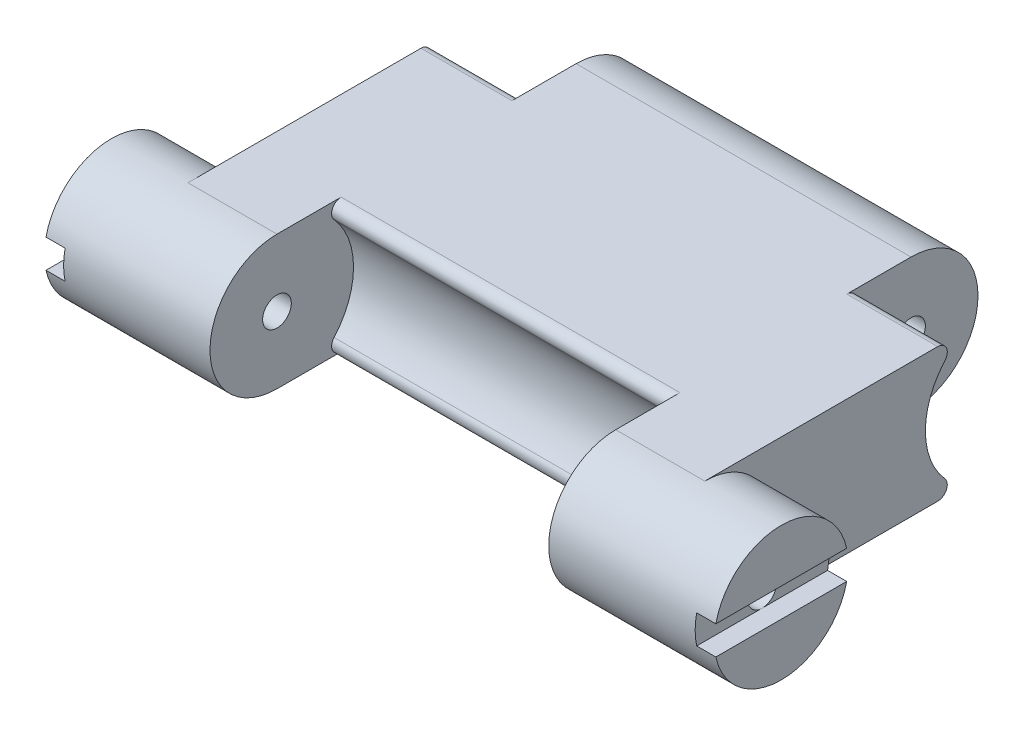
ISO-10303-21;
HEADER;
FILE_DESCRIPTION(('STEP AP214'),'2;1');
FILE_NAME('part.step','',(''),(''),'','','');
FILE_SCHEMA(('AUTOMOTIVE_DESIGN { 1 0 10303 214 1 1 1 1 }'));
ENDSEC;
DATA;
#1=APPLICATION_CONTEXT('core data for automotive mechanical design processes');
#2=APPLICATION_PROTOCOL_DEFINITION('international standard','automotive_design',2000,#1);
#3=PRODUCT_CONTEXT('',#1,'mechanical');
#4=PRODUCT('Part','Part','',(#3));
#5=PRODUCT_RELATED_PRODUCT_CATEGORY('part','',(#4));
#6=PRODUCT_DEFINITION_FORMATION('','',#4);
#7=PRODUCT_DEFINITION_CONTEXT('part definition',#1,'design');
#8=PRODUCT_DEFINITION('design','',#6,#7);
#9=PRODUCT_DEFINITION_SHAPE('','',#8);
#10=(LENGTH_UNIT() NAMED_UNIT(*) SI_UNIT(.MILLI.,.METRE.));
#11=(NAMED_UNIT(*) PLANE_ANGLE_UNIT() SI_UNIT($,.RADIAN.));
#12=(NAMED_UNIT(*) SI_UNIT($,.STERADIAN.) SOLID_ANGLE_UNIT());
#13=UNCERTAINTY_MEASURE_WITH_UNIT(LENGTH_MEASURE(1.E-05),#10,'distance_accuracy_value','');
#14=(GEOMETRIC_REPRESENTATION_CONTEXT(3) GLOBAL_UNCERTAINTY_ASSIGNED_CONTEXT((#13)) GLOBAL_UNIT_ASSIGNED_CONTEXT((#10,
#11,#12)) REPRESENTATION_CONTEXT('',''));
#15=CARTESIAN_POINT('',(0.,0.,0.));
#16=DIRECTION('',(0.,0.,1.));
#17=DIRECTION('',(1.,0.,0.));
#18=AXIS2_PLACEMENT_3D('',#15,#16,#17);
#19=CARTESIAN_POINT('',(16.5,0.,0.));
#20=DIRECTION('',(-1.,0.,0.));
#21=DIRECTION('',(0.,0.,1.));
#22=AXIS2_PLACEMENT_3D('',#19,#20,#21);
#23=PLANE('',#22);
#24=DIRECTION('',(0.,0.,1.));
#25=VECTOR('',#24,1.);
#26=CARTESIAN_POINT('',(16.5,4.25,11.365));
#27=LINE('',#26,#25);
#28=CARTESIAN_POINT('',(16.5,4.25,4.34630141720567));
#29=VERTEX_POINT('',#28);
#30=CARTESIAN_POINT('',(16.5,4.25,7.765));
#31=VERTEX_POINT('',#30);
#32=EDGE_CURVE('E299',#29,#31,#27,.T.);
#33=ORIENTED_EDGE('',*,*,#32,.T.);
#34=CARTESIAN_POINT('',(16.5,3.5,7.765));
#35=DIRECTION('',(-1.,0.,0.));
#36=DIRECTION('',(0.,0.,1.));
#37=AXIS2_PLACEMENT_3D('',#34,#35,#36);
#38=CIRCLE('',#37,0.749999999999999);
#39=CARTESIAN_POINT('',(16.5,2.75,7.765));
#40=VERTEX_POINT('',#39);
#41=EDGE_CURVE('E63',#31,#40,#38,.T.);
#42=ORIENTED_EDGE('',*,*,#41,.T.);
#43=DIRECTION('',(0.,0.,-1.));
#44=VECTOR('',#43,1.);
#45=CARTESIAN_POINT('',(16.5,2.75,11.365));
#46=LINE('',#45,#44);
#47=CARTESIAN_POINT('',(16.5,2.75,4.34630141720567));
#48=VERTEX_POINT('',#47);
#49=EDGE_CURVE('E298',#40,#48,#46,.T.);
#50=ORIENTED_EDGE('',*,*,#49,.T.);
#51=CARTESIAN_POINT('',(16.5,3.5,7.765));
#52=DIRECTION('',(-1.,0.,0.));
#53=DIRECTION('',(0.,0.,1.));
#54=AXIS2_PLACEMENT_3D('',#51,#52,#53);
#55=CIRCLE('',#54,3.5);
#56=EDGE_CURVE('E408',#29,#48,#55,.T.);
#57=ORIENTED_EDGE('',*,*,#56,.F.);
#58=EDGE_LOOP('',(#33,#42,#50,#57));
#59=FACE_BOUND('',#58,.T.);
#60=ADVANCED_FACE('F47',(#59),#23,.F.);
#61=CARTESIAN_POINT('',(-16.5,0.,0.));
#62=DIRECTION('',(1.,0.,0.));
#63=DIRECTION('',(0.,0.,1.));
#64=AXIS2_PLACEMENT_3D('',#61,#62,#63);
#65=PLANE('',#64);
#66=DIRECTION('',(0.,0.,1.));
#67=VECTOR('',#66,1.);
#68=CARTESIAN_POINT('',(-16.5,4.25,11.365));
#69=LINE('',#68,#67);
#70=CARTESIAN_POINT('',(-16.5,4.25,7.765));
#71=VERTEX_POINT('',#70);
#72=CARTESIAN_POINT('',(-16.5,4.25,11.1836985827943));
#73=VERTEX_POINT('',#72);
#74=EDGE_CURVE('E246',#71,#73,#69,.T.);
#75=ORIENTED_EDGE('',*,*,#74,.F.);
#76=CARTESIAN_POINT('',(-16.5,3.5,7.765));
#77=DIRECTION('',(1.,0.,0.));
#78=DIRECTION('',(0.,0.,-1.));
#79=AXIS2_PLACEMENT_3D('',#76,#77,#78);
#80=CIRCLE('',#79,0.749999999999999);
#81=CARTESIAN_POINT('',(-16.5,2.75,7.765));
#82=VERTEX_POINT('',#81);
#83=EDGE_CURVE('E70',#71,#82,#80,.T.);
#84=ORIENTED_EDGE('',*,*,#83,.T.);
#85=DIRECTION('',(0.,0.,-1.));
#86=VECTOR('',#85,1.);
#87=CARTESIAN_POINT('',(-16.5,2.75,11.365));
#88=LINE('',#87,#86);
#89=CARTESIAN_POINT('',(-16.5,2.75,11.1836985827943));
#90=VERTEX_POINT('',#89);
#91=EDGE_CURVE('E244',#90,#82,#88,.T.);
#92=ORIENTED_EDGE('',*,*,#91,.F.);
#93=CARTESIAN_POINT('',(-16.5,3.5,7.765));
#94=DIRECTION('',(1.,0.,0.));
#95=DIRECTION('',(0.,0.,-1.));
#96=AXIS2_PLACEMENT_3D('',#93,#94,#95);
#97=CIRCLE('',#96,3.5);
#98=EDGE_CURVE('E435',#73,#90,#97,.T.);
#99=ORIENTED_EDGE('',*,*,#98,.F.);
#100=EDGE_LOOP('',(#75,#84,#92,#99));
#101=FACE_BOUND('',#100,.T.);
#102=ADVANCED_FACE('F241',(#101),#65,.F.);
#103=CARTESIAN_POINT('',(17.5,3.5,7.765));
#104=DIRECTION('',(-1.,0.,0.));
#105=DIRECTION('',(0.,0.,1.));
#106=AXIS2_PLACEMENT_3D('',#103,#104,#105);
#107=CYLINDRICAL_SURFACE('',#106,3.5);
#108=CARTESIAN_POINT('',(-8.85,3.5,7.765));
#109=DIRECTION('',(1.,0.,0.));
#110=DIRECTION('',(0.,0.,-1.));
#111=AXIS2_PLACEMENT_3D('',#108,#109,#110);
#112=CIRCLE('',#111,3.5);
#113=CARTESIAN_POINT('',(-8.85,7.,7.765));
#114=VERTEX_POINT('',#113);
#115=CARTESIAN_POINT('',(-8.85,0.,7.765));
#116=VERTEX_POINT('',#115);
#117=EDGE_CURVE('E397',#114,#116,#112,.T.);
#118=ORIENTED_EDGE('',*,*,#117,.F.);
#119=DIRECTION('',(-1.,0.,0.));
#120=VECTOR('',#119,1.);
#121=CARTESIAN_POINT('',(17.5,7.,7.765));
#122=LINE('',#121,#120);
#123=CARTESIAN_POINT('',(-13.5,7.,7.765));
#124=VERTEX_POINT('',#123);
#125=EDGE_CURVE('E367',#114,#124,#122,.T.);
#126=ORIENTED_EDGE('',*,*,#125,.T.);
#127=CARTESIAN_POINT('',(-13.5,3.5,7.765));
#128=DIRECTION('',(1.,0.,0.));
#129=DIRECTION('',(0.,0.,-1.));
#130=AXIS2_PLACEMENT_3D('',#127,#128,#129);
#131=CIRCLE('',#130,3.5);
#132=CARTESIAN_POINT('',(-13.5,0.,7.765));
#133=VERTEX_POINT('',#132);
#134=EDGE_CURVE('E343',#133,#124,#131,.T.);
#135=ORIENTED_EDGE('',*,*,#134,.F.);
#136=DIRECTION('',(-1.,0.,0.));
#137=VECTOR('',#136,1.);
#138=CARTESIAN_POINT('',(17.5,0.,7.765));
#139=LINE('',#138,#137);
#140=EDGE_CURVE('E385',#116,#133,#139,.T.);
#141=ORIENTED_EDGE('',*,*,#140,.F.);
#142=EDGE_LOOP('',(#118,#126,#135,#141));
#143=FACE_BOUND('',#142,.T.);
#144=DIRECTION('',(-1.,0.,0.));
#145=VECTOR('',#144,1.);
#146=CARTESIAN_POINT('',(17.5,2.75,11.1836985827943));
#147=LINE('',#146,#145);
#148=CARTESIAN_POINT('',(-17.5,2.75,11.1836985827943));
#149=VERTEX_POINT('',#148);
#150=EDGE_CURVE('E262',#149,#90,#147,.F.);
#151=ORIENTED_EDGE('',*,*,#150,.F.);
#152=CARTESIAN_POINT('',(-17.5,3.5,7.765));
#153=DIRECTION('',(1.,0.,0.));
#154=DIRECTION('',(0.,0.,-1.));
#155=AXIS2_PLACEMENT_3D('',#152,#153,#154);
#156=CIRCLE('',#155,3.5);
#157=CARTESIAN_POINT('',(-17.5,2.75,4.34630141720567));
#158=VERTEX_POINT('',#157);
#159=EDGE_CURVE('E362',#149,#158,#156,.T.);
#160=ORIENTED_EDGE('',*,*,#159,.T.);
#161=DIRECTION('',(-1.,0.,0.));
#162=VECTOR('',#161,1.);
#163=CARTESIAN_POINT('',(17.5,2.75,4.34630141720567));
#164=LINE('',#163,#162);
#165=CARTESIAN_POINT('',(-16.5,2.75,4.34630141720567));
#166=VERTEX_POINT('',#165);
#167=EDGE_CURVE('E275',#166,#158,#164,.T.);
#168=ORIENTED_EDGE('',*,*,#167,.F.);
#169=CARTESIAN_POINT('',(-16.5,4.25,4.34630141720567));
#170=VERTEX_POINT('',#169);
#171=EDGE_CURVE('E254',#166,#170,#97,.T.);
#172=ORIENTED_EDGE('',*,*,#171,.T.);
#173=DIRECTION('',(-1.,0.,0.));
#174=VECTOR('',#173,1.);
#175=CARTESIAN_POINT('',(17.5,4.25,4.34630141720567));
#176=LINE('',#175,#174);
#177=CARTESIAN_POINT('',(-17.5,4.25,4.34630141720567));
#178=VERTEX_POINT('',#177);
#179=EDGE_CURVE('E264',#178,#170,#176,.F.);
#180=ORIENTED_EDGE('',*,*,#179,.F.);
#181=CARTESIAN_POINT('',(-17.5,4.25,11.1836985827943));
#182=VERTEX_POINT('',#181);
#183=EDGE_CURVE('E369',#178,#182,#156,.T.);
#184=ORIENTED_EDGE('',*,*,#183,.T.);
#185=DIRECTION('',(-1.,0.,0.));
#186=VECTOR('',#185,1.);
#187=CARTESIAN_POINT('',(17.5,4.25,11.1836985827943));
#188=LINE('',#187,#186);
#189=EDGE_CURVE('E266',#73,#182,#188,.T.);
#190=ORIENTED_EDGE('',*,*,#189,.F.);
#191=ORIENTED_EDGE('',*,*,#98,.T.);
#192=EDGE_LOOP('',(#151,#160,#168,#172,#180,#184,#190,#191));
#193=FACE_BOUND('',#192,.T.);
#194=ADVANCED_FACE('F576',(#143,#193),#107,.T.);
#195=CARTESIAN_POINT('',(-17.5,3.5,7.765));
#196=DIRECTION('',(1.,0.,0.));
#197=DIRECTION('',(0.,0.,-1.));
#198=AXIS2_PLACEMENT_3D('',#195,#196,#197);
#199=PLANE('',#198);
#200=DIRECTION('',(0.,0.,1.));
#201=VECTOR('',#200,1.);
#202=CARTESIAN_POINT('',(-17.5,2.75,7.765));
#203=LINE('',#202,#201);
#204=EDGE_CURVE('E430',#158,#149,#203,.T.);
#205=ORIENTED_EDGE('',*,*,#204,.F.);
#206=ORIENTED_EDGE('',*,*,#159,.F.);
#207=EDGE_LOOP('',(#205,#206));
#208=FACE_BOUND('',#207,.T.);
#209=ADVANCED_FACE('F610',(#208),#199,.F.);
#210=DIRECTION('',(0.,0.,-1.));
#211=VECTOR('',#210,1.);
#212=CARTESIAN_POINT('',(-17.5,4.25,7.765));
#213=LINE('',#212,#211);
#214=EDGE_CURVE('E427',#182,#178,#213,.T.);
#215=ORIENTED_EDGE('',*,*,#214,.F.);
#216=ORIENTED_EDGE('',*,*,#183,.F.);
#217=EDGE_LOOP('',(#215,#216));
#218=FACE_BOUND('',#217,.T.);
#219=ADVANCED_FACE('F608',(#218),#199,.F.);
#220=CARTESIAN_POINT('',(17.5,3.5,-7.765));
#221=DIRECTION('',(-1.,0.,0.));
#222=DIRECTION('',(0.,0.,1.));
#223=AXIS2_PLACEMENT_3D('',#220,#221,#222);
#224=CYLINDRICAL_SURFACE('',#223,3.5);
#225=CARTESIAN_POINT('',(-8.75,3.5,-7.765));
#226=DIRECTION('',(-1.,0.,0.));
#227=DIRECTION('',(0.,0.,1.));
#228=AXIS2_PLACEMENT_3D('',#225,#226,#227);
#229=CIRCLE('',#228,3.5);
#230=CARTESIAN_POINT('',(-8.75,7.,-7.765));
#231=VERTEX_POINT('',#230);
#232=CARTESIAN_POINT('',(-8.75,0.,-7.765));
#233=VERTEX_POINT('',#232);
#234=EDGE_CURVE('E283',#231,#233,#229,.T.);
#235=ORIENTED_EDGE('',*,*,#234,.F.);
#236=DIRECTION('',(-1.,0.,0.));
#237=VECTOR('',#236,1.);
#238=CARTESIAN_POINT('',(17.5,7.,-7.765));
#239=LINE('',#238,#237);
#240=CARTESIAN_POINT('',(8.75,7.,-7.765));
#241=VERTEX_POINT('',#240);
#242=EDGE_CURVE('E377',#241,#231,#239,.T.);
#243=ORIENTED_EDGE('',*,*,#242,.F.);
#244=CARTESIAN_POINT('',(8.75,3.5,-7.765));
#245=DIRECTION('',(1.,0.,0.));
#246=DIRECTION('',(0.,0.,-1.));
#247=AXIS2_PLACEMENT_3D('',#244,#245,#246);
#248=CIRCLE('',#247,3.5);
#249=CARTESIAN_POINT('',(8.75,0.,-7.765));
#250=VERTEX_POINT('',#249);
#251=EDGE_CURVE('E400',#250,#241,#248,.T.);
#252=ORIENTED_EDGE('',*,*,#251,.F.);
#253=DIRECTION('',(-1.,0.,0.));
#254=VECTOR('',#253,1.);
#255=CARTESIAN_POINT('',(17.5,0.,-7.765));
#256=LINE('',#255,#254);
#257=EDGE_CURVE('E381',#250,#233,#256,.T.);
#258=ORIENTED_EDGE('',*,*,#257,.T.);
#259=EDGE_LOOP('',(#235,#243,#252,#258));
#260=FACE_BOUND('',#259,.T.);
#261=ADVANCED_FACE('F548',(#260),#224,.T.);
#262=CARTESIAN_POINT('',(17.5,0.,7.765));
#263=DIRECTION('',(0.,1.,0.));
#264=DIRECTION('',(0.,0.,1.));
#265=AXIS2_PLACEMENT_3D('',#262,#263,#264);
#266=PLANE('',#265);
#267=DIRECTION('',(0.,0.,1.));
#268=VECTOR('',#267,1.);
#269=CARTESIAN_POINT('',(-13.5,0.,7.765));
#270=LINE('',#269,#268);
#271=CARTESIAN_POINT('',(-13.5,0.,-4.41089803375031));
#272=VERTEX_POINT('',#271);
#273=EDGE_CURVE('E351',#272,#133,#270,.T.);
#274=ORIENTED_EDGE('',*,*,#273,.F.);
#275=DIRECTION('',(1.,0.,0.));
#276=VECTOR('',#275,1.);
#277=CARTESIAN_POINT('',(-8.75,0.,-4.41089803375031));
#278=LINE('',#277,#276);
#279=CARTESIAN_POINT('',(-8.75,0.,-4.41089803375031));
#280=VERTEX_POINT('',#279);
#281=EDGE_CURVE('E458',#272,#280,#278,.T.);
#282=ORIENTED_EDGE('',*,*,#281,.T.);
#283=DIRECTION('',(0.,0.,1.));
#284=VECTOR('',#283,1.);
#285=CARTESIAN_POINT('',(-8.75,0.,7.765));
#286=LINE('',#285,#284);
#287=EDGE_CURVE('E289',#233,#280,#286,.T.);
#288=ORIENTED_EDGE('',*,*,#287,.F.);
#289=ORIENTED_EDGE('',*,*,#257,.F.);
#290=DIRECTION('',(0.,0.,-1.));
#291=VECTOR('',#290,1.);
#292=CARTESIAN_POINT('',(8.75,0.,7.765));
#293=LINE('',#292,#291);
#294=CARTESIAN_POINT('',(8.75,0.,-4.41089803375031));
#295=VERTEX_POINT('',#294);
#296=EDGE_CURVE('E319',#295,#250,#293,.T.);
#297=ORIENTED_EDGE('',*,*,#296,.F.);
#298=DIRECTION('',(1.,0.,0.));
#299=VECTOR('',#298,1.);
#300=CARTESIAN_POINT('',(17.5,0.,-4.41089803375031));
#301=LINE('',#300,#299);
#302=CARTESIAN_POINT('',(13.5,0.,-4.41089803375031));
#303=VERTEX_POINT('',#302);
#304=EDGE_CURVE('E450',#295,#303,#301,.T.);
#305=ORIENTED_EDGE('',*,*,#304,.T.);
#306=DIRECTION('',(0.,0.,-1.));
#307=VECTOR('',#306,1.);
#308=CARTESIAN_POINT('',(13.5,0.,7.765));
#309=LINE('',#308,#307);
#310=CARTESIAN_POINT('',(13.5,0.,7.765));
#311=VERTEX_POINT('',#310);
#312=EDGE_CURVE('E358',#311,#303,#309,.T.);
#313=ORIENTED_EDGE('',*,*,#312,.F.);
#314=CARTESIAN_POINT('',(8.85,0.,7.765));
#315=VERTEX_POINT('',#314);
#316=EDGE_CURVE('E386',#311,#315,#139,.T.);
#317=ORIENTED_EDGE('',*,*,#316,.T.);
#318=DIRECTION('',(0.,0.,-1.));
#319=VECTOR('',#318,1.);
#320=CARTESIAN_POINT('',(8.85,0.,7.765));
#321=LINE('',#320,#319);
#322=CARTESIAN_POINT('',(8.85,0.,4.41089803375031));
#323=VERTEX_POINT('',#322);
#324=EDGE_CURVE('E334',#315,#323,#321,.T.);
#325=ORIENTED_EDGE('',*,*,#324,.T.);
#326=DIRECTION('',(1.,0.,0.));
#327=VECTOR('',#326,1.);
#328=CARTESIAN_POINT('',(17.5,0.,4.41089803375031));
#329=LINE('',#328,#327);
#330=CARTESIAN_POINT('',(-8.85,0.,4.41089803375031));
#331=VERTEX_POINT('',#330);
#332=EDGE_CURVE('E454',#323,#331,#329,.F.);
#333=ORIENTED_EDGE('',*,*,#332,.T.);
#334=DIRECTION('',(0.,0.,-1.));
#335=VECTOR('',#334,1.);
#336=CARTESIAN_POINT('',(-8.85,0.,7.765));
#337=LINE('',#336,#335);
#338=EDGE_CURVE('E340',#116,#331,#337,.T.);
#339=ORIENTED_EDGE('',*,*,#338,.F.);
#340=ORIENTED_EDGE('',*,*,#140,.T.);
#341=EDGE_LOOP('',(#274,#282,#288,#289,#297,#305,#313,#317,#325,#333,#339,#340));
#342=FACE_BOUND('',#341,.T.);
#343=ADVANCED_FACE('F540',(#342),#266,.F.);
#344=CARTESIAN_POINT('',(17.5,7.,7.765));
#345=DIRECTION('',(0.,-1.,0.));
#346=DIRECTION('',(0.,0.,-1.));
#347=AXIS2_PLACEMENT_3D('',#344,#345,#346);
#348=PLANE('',#347);
#349=DIRECTION('',(0.,0.,-1.));
#350=VECTOR('',#349,1.);
#351=CARTESIAN_POINT('',(-8.75,7.,7.765));
#352=LINE('',#351,#350);
#353=CARTESIAN_POINT('',(-8.75,7.,-4.41089803375031));
#354=VERTEX_POINT('',#353);
#355=EDGE_CURVE('E424',#354,#231,#352,.T.);
#356=ORIENTED_EDGE('',*,*,#355,.F.);
#357=DIRECTION('',(1.,0.,0.));
#358=VECTOR('',#357,1.);
#359=CARTESIAN_POINT('',(-13.5,7.,-4.41089803375031));
#360=LINE('',#359,#358);
#361=CARTESIAN_POINT('',(-13.5,7.,-4.41089803375031));
#362=VERTEX_POINT('',#361);
#363=EDGE_CURVE('E470',#354,#362,#360,.F.);
#364=ORIENTED_EDGE('',*,*,#363,.T.);
#365=DIRECTION('',(0.,0.,-1.));
#366=VECTOR('',#365,1.);
#367=CARTESIAN_POINT('',(-13.5,7.,7.765));
#368=LINE('',#367,#366);
#369=EDGE_CURVE('E347',#124,#362,#368,.T.);
#370=ORIENTED_EDGE('',*,*,#369,.F.);
#371=ORIENTED_EDGE('',*,*,#125,.F.);
#372=DIRECTION('',(0.,0.,1.));
#373=VECTOR('',#372,1.);
#374=CARTESIAN_POINT('',(-8.85,7.,7.765));
#375=LINE('',#374,#373);
#376=CARTESIAN_POINT('',(-8.85,7.,4.41089803375031));
#377=VERTEX_POINT('',#376);
#378=EDGE_CURVE('E337',#377,#114,#375,.T.);
#379=ORIENTED_EDGE('',*,*,#378,.F.);
#380=DIRECTION('',(1.,0.,0.));
#381=VECTOR('',#380,1.);
#382=CARTESIAN_POINT('',(17.5,7.,4.41089803375031));
#383=LINE('',#382,#381);
#384=CARTESIAN_POINT('',(8.85,7.,4.41089803375031));
#385=VERTEX_POINT('',#384);
#386=EDGE_CURVE('E466',#377,#385,#383,.T.);
#387=ORIENTED_EDGE('',*,*,#386,.T.);
#388=DIRECTION('',(0.,0.,1.));
#389=VECTOR('',#388,1.);
#390=CARTESIAN_POINT('',(8.85,7.,7.765));
#391=LINE('',#390,#389);
#392=CARTESIAN_POINT('',(8.85,7.,7.765));
#393=VERTEX_POINT('',#392);
#394=EDGE_CURVE('E327',#385,#393,#391,.T.);
#395=ORIENTED_EDGE('',*,*,#394,.T.);
#396=CARTESIAN_POINT('',(13.5,7.,7.765));
#397=VERTEX_POINT('',#396);
#398=EDGE_CURVE('E373',#397,#393,#122,.T.);
#399=ORIENTED_EDGE('',*,*,#398,.F.);
#400=DIRECTION('',(0.,0.,1.));
#401=VECTOR('',#400,1.);
#402=CARTESIAN_POINT('',(13.5,7.,7.765));
#403=LINE('',#402,#401);
#404=CARTESIAN_POINT('',(13.5,7.,-4.41089803375031));
#405=VERTEX_POINT('',#404);
#406=EDGE_CURVE('E390',#405,#397,#403,.T.);
#407=ORIENTED_EDGE('',*,*,#406,.F.);
#408=DIRECTION('',(1.,0.,0.));
#409=VECTOR('',#408,1.);
#410=CARTESIAN_POINT('',(17.5,7.,-4.41089803375031));
#411=LINE('',#410,#409);
#412=CARTESIAN_POINT('',(8.75,7.,-4.41089803375031));
#413=VERTEX_POINT('',#412);
#414=EDGE_CURVE('E462',#405,#413,#411,.F.);
#415=ORIENTED_EDGE('',*,*,#414,.T.);
#416=DIRECTION('',(0.,0.,1.));
#417=VECTOR('',#416,1.);
#418=CARTESIAN_POINT('',(8.75,7.,7.765));
#419=LINE('',#418,#417);
#420=EDGE_CURVE('E313',#241,#413,#419,.T.);
#421=ORIENTED_EDGE('',*,*,#420,.F.);
#422=ORIENTED_EDGE('',*,*,#242,.T.);
#423=EDGE_LOOP('',(#356,#364,#370,#371,#379,#387,#395,#399,#407,#415,#421,#422));
#424=FACE_BOUND('',#423,.T.);
#425=ADVANCED_FACE('F533',(#424),#348,.F.);
#426=CARTESIAN_POINT('',(17.5,3.5,7.765));
#427=DIRECTION('',(1.,0.,0.));
#428=DIRECTION('',(0.,0.,-1.));
#429=AXIS2_PLACEMENT_3D('',#426,#427,#428);
#430=PLANE('',#429);
#431=DIRECTION('',(0.,0.,1.));
#432=VECTOR('',#431,1.);
#433=CARTESIAN_POINT('',(17.5,4.25,11.365));
#434=LINE('',#433,#432);
#435=CARTESIAN_POINT('',(17.5,4.25,4.34630141720567));
#436=VERTEX_POINT('',#435);
#437=CARTESIAN_POINT('',(17.5,4.25,11.1836985827943));
#438=VERTEX_POINT('',#437);
#439=EDGE_CURVE('E306',#436,#438,#434,.T.);
#440=ORIENTED_EDGE('',*,*,#439,.F.);
#441=CARTESIAN_POINT('',(17.5,3.5,7.765));
#442=DIRECTION('',(1.,0.,0.));
#443=DIRECTION('',(0.,0.,-1.));
#444=AXIS2_PLACEMENT_3D('',#441,#442,#443);
#445=CIRCLE('',#444,3.5);
#446=EDGE_CURVE('E363',#436,#438,#445,.T.);
#447=ORIENTED_EDGE('',*,*,#446,.T.);
#448=EDGE_LOOP('',(#440,#447));
#449=FACE_BOUND('',#448,.T.);
#450=ADVANCED_FACE('F645',(#449),#430,.T.);
#451=DIRECTION('',(0.,0.,-1.));
#452=VECTOR('',#451,1.);
#453=CARTESIAN_POINT('',(17.5,2.75,11.365));
#454=LINE('',#453,#452);
#455=CARTESIAN_POINT('',(17.5,2.75,11.1836985827943));
#456=VERTEX_POINT('',#455);
#457=CARTESIAN_POINT('',(17.5,2.75,4.34630141720567));
#458=VERTEX_POINT('',#457);
#459=EDGE_CURVE('E292',#456,#458,#454,.T.);
#460=ORIENTED_EDGE('',*,*,#459,.F.);
#461=EDGE_CURVE('E368',#456,#458,#445,.T.);
#462=ORIENTED_EDGE('',*,*,#461,.T.);
#463=EDGE_LOOP('',(#460,#462));
#464=FACE_BOUND('',#463,.T.);
#465=ADVANCED_FACE('F643',(#464),#430,.T.);
#466=ORIENTED_EDGE('',*,*,#446,.F.);
#467=DIRECTION('',(-1.,0.,0.));
#468=VECTOR('',#467,1.);
#469=CARTESIAN_POINT('',(17.5,4.25,4.34630141720567));
#470=LINE('',#469,#468);
#471=EDGE_CURVE('E420',#436,#29,#470,.T.);
#472=ORIENTED_EDGE('',*,*,#471,.T.);
#473=ORIENTED_EDGE('',*,*,#56,.T.);
#474=DIRECTION('',(-1.,0.,0.));
#475=VECTOR('',#474,1.);
#476=CARTESIAN_POINT('',(17.5,2.75,4.34630141720567));
#477=LINE('',#476,#475);
#478=EDGE_CURVE('E416',#48,#458,#477,.F.);
#479=ORIENTED_EDGE('',*,*,#478,.T.);
#480=ORIENTED_EDGE('',*,*,#461,.F.);
#481=DIRECTION('',(-1.,0.,0.));
#482=VECTOR('',#481,1.);
#483=CARTESIAN_POINT('',(17.5,2.75,11.1836985827943));
#484=LINE('',#483,#482);
#485=CARTESIAN_POINT('',(16.5,2.75,11.1836985827943));
#486=VERTEX_POINT('',#485);
#487=EDGE_CURVE('E407',#456,#486,#484,.T.);
#488=ORIENTED_EDGE('',*,*,#487,.T.);
#489=CARTESIAN_POINT('',(16.5,4.25,11.1836985827943));
#490=VERTEX_POINT('',#489);
#491=EDGE_CURVE('E403',#486,#490,#55,.T.);
#492=ORIENTED_EDGE('',*,*,#491,.T.);
#493=DIRECTION('',(-1.,0.,0.));
#494=VECTOR('',#493,1.);
#495=CARTESIAN_POINT('',(17.5,4.25,11.1836985827943));
#496=LINE('',#495,#494);
#497=EDGE_CURVE('E412',#490,#438,#496,.F.);
#498=ORIENTED_EDGE('',*,*,#497,.T.);
#499=EDGE_LOOP('',(#466,#472,#473,#479,#480,#488,#492,#498));
#500=FACE_BOUND('',#499,.T.);
#501=ORIENTED_EDGE('',*,*,#398,.T.);
#502=CARTESIAN_POINT('',(8.85,3.5,7.765));
#503=DIRECTION('',(1.,0.,0.));
#504=DIRECTION('',(0.,0.,-1.));
#505=AXIS2_PLACEMENT_3D('',#502,#503,#504);
#506=CIRCLE('',#505,3.5);
#507=EDGE_CURVE('E393',#393,#315,#506,.T.);
#508=ORIENTED_EDGE('',*,*,#507,.T.);
#509=ORIENTED_EDGE('',*,*,#316,.F.);
#510=CARTESIAN_POINT('',(13.5,3.5,7.765));
#511=DIRECTION('',(1.,0.,0.));
#512=DIRECTION('',(0.,0.,-1.));
#513=AXIS2_PLACEMENT_3D('',#510,#511,#512);
#514=CIRCLE('',#513,3.5);
#515=EDGE_CURVE('E354',#311,#397,#514,.T.);
#516=ORIENTED_EDGE('',*,*,#515,.T.);
#517=EDGE_LOOP('',(#501,#508,#509,#516));
#518=FACE_BOUND('',#517,.T.);
#519=ADVANCED_FACE('F535',(#500,#518),#107,.T.);
#520=CARTESIAN_POINT('',(13.5,0.,0.));
#521=DIRECTION('',(1.,0.,0.));
#522=DIRECTION('',(0.,0.,-1.));
#523=AXIS2_PLACEMENT_3D('',#520,#521,#522);
#524=PLANE('',#523);
#525=CARTESIAN_POINT('',(13.5,3.5,-7.765));
#526=DIRECTION('',(1.,0.,0.));
#527=DIRECTION('',(0.,0.,-1.));
#528=AXIS2_PLACEMENT_3D('',#525,#526,#527);
#529=CIRCLE('',#528,4.);
#530=CARTESIAN_POINT('',(13.5,6.16666666666667,-4.78357603000028));
#531=VERTEX_POINT('',#530);
#532=CARTESIAN_POINT('',(13.5,0.833333333333337,-4.78357603000028));
#533=VERTEX_POINT('',#532);
#534=EDGE_CURVE('E303',#531,#533,#529,.T.);
#535=ORIENTED_EDGE('',*,*,#534,.F.);
#536=CARTESIAN_POINT('',(13.5,6.5,-4.41089803375031));
#537=DIRECTION('',(1.,0.,0.));
#538=DIRECTION('',(0.,0.,-1.));
#539=AXIS2_PLACEMENT_3D('',#536,#537,#538);
#540=CIRCLE('',#539,0.5);
#541=EDGE_CURVE('E488',#531,#405,#540,.T.);
#542=ORIENTED_EDGE('',*,*,#541,.T.);
#543=ORIENTED_EDGE('',*,*,#406,.T.);
#544=ORIENTED_EDGE('',*,*,#515,.F.);
#545=ORIENTED_EDGE('',*,*,#312,.T.);
#546=CARTESIAN_POINT('',(13.5,0.500000000000003,-4.41089803375031));
#547=DIRECTION('',(1.,0.,0.));
#548=DIRECTION('',(0.,0.,-1.));
#549=AXIS2_PLACEMENT_3D('',#546,#547,#548);
#550=CIRCLE('',#549,0.5);
#551=EDGE_CURVE('E485',#303,#533,#550,.T.);
#552=ORIENTED_EDGE('',*,*,#551,.T.);
#553=EDGE_LOOP('',(#535,#542,#543,#544,#545,#552));
#554=FACE_BOUND('',#553,.T.);
#555=ADVANCED_FACE('F530',(#554),#524,.T.);
#556=CARTESIAN_POINT('',(-13.5,0.,0.));
#557=DIRECTION('',(-1.,0.,0.));
#558=DIRECTION('',(0.,0.,-1.));
#559=AXIS2_PLACEMENT_3D('',#556,#557,#558);
#560=PLANE('',#559);
#561=CARTESIAN_POINT('',(-13.5,3.5,-7.765));
#562=DIRECTION('',(1.,0.,0.));
#563=DIRECTION('',(0.,0.,-1.));
#564=AXIS2_PLACEMENT_3D('',#561,#562,#563);
#565=CIRCLE('',#564,4.);
#566=CARTESIAN_POINT('',(-13.5,6.16666666666667,-4.78357603000028));
#567=VERTEX_POINT('',#566);
#568=CARTESIAN_POINT('',(-13.5,0.833333333333337,-4.78357603000028));
#569=VERTEX_POINT('',#568);
#570=EDGE_CURVE('E278',#567,#569,#565,.T.);
#571=ORIENTED_EDGE('',*,*,#570,.T.);
#572=CARTESIAN_POINT('',(-13.5,0.500000000000003,-4.41089803375031));
#573=DIRECTION('',(-1.,0.,0.));
#574=DIRECTION('',(0.,0.,1.));
#575=AXIS2_PLACEMENT_3D('',#572,#573,#574);
#576=CIRCLE('',#575,0.5);
#577=EDGE_CURVE('E447',#569,#272,#576,.T.);
#578=ORIENTED_EDGE('',*,*,#577,.T.);
#579=ORIENTED_EDGE('',*,*,#273,.T.);
#580=ORIENTED_EDGE('',*,*,#134,.T.);
#581=ORIENTED_EDGE('',*,*,#369,.T.);
#582=CARTESIAN_POINT('',(-13.5,6.5,-4.41089803375031));
#583=DIRECTION('',(-1.,0.,0.));
#584=DIRECTION('',(0.,0.,1.));
#585=AXIS2_PLACEMENT_3D('',#582,#583,#584);
#586=CIRCLE('',#585,0.5);
#587=EDGE_CURVE('E444',#362,#567,#586,.T.);
#588=ORIENTED_EDGE('',*,*,#587,.T.);
#589=EDGE_LOOP('',(#571,#578,#579,#580,#581,#588));
#590=FACE_BOUND('',#589,.T.);
#591=ADVANCED_FACE('F563',(#590),#560,.T.);
#592=CARTESIAN_POINT('',(-8.85,3.5,7.765));
#593=DIRECTION('',(1.,0.,0.));
#594=DIRECTION('',(0.,0.,-1.));
#595=AXIS2_PLACEMENT_3D('',#592,#593,#594);
#596=CYLINDRICAL_SURFACE('',#595,4.);
#597=CARTESIAN_POINT('',(8.85,3.5,7.765));
#598=DIRECTION('',(1.,0.,0.));
#599=DIRECTION('',(0.,0.,-1.));
#600=AXIS2_PLACEMENT_3D('',#597,#598,#599);
#601=CIRCLE('',#600,4.);
#602=CARTESIAN_POINT('',(8.85,0.833333333333335,4.78357603000028));
#603=VERTEX_POINT('',#602);
#604=CARTESIAN_POINT('',(8.85,6.16666666666667,4.78357603000028));
#605=VERTEX_POINT('',#604);
#606=EDGE_CURVE('E322',#603,#605,#601,.T.);
#607=ORIENTED_EDGE('',*,*,#606,.T.);
#608=DIRECTION('',(1.,0.,0.));
#609=VECTOR('',#608,1.);
#610=CARTESIAN_POINT('',(-8.85,6.16666666666667,4.78357603000028));
#611=LINE('',#610,#609);
#612=CARTESIAN_POINT('',(-8.85,6.16666666666667,4.78357603000028));
#613=VERTEX_POINT('',#612);
#614=EDGE_CURVE('E476',#605,#613,#611,.F.);
#615=ORIENTED_EDGE('',*,*,#614,.T.);
#616=CARTESIAN_POINT('',(-8.85,3.5,7.765));
#617=DIRECTION('',(1.,0.,0.));
#618=DIRECTION('',(0.,0.,-1.));
#619=AXIS2_PLACEMENT_3D('',#616,#617,#618);
#620=CIRCLE('',#619,4.);
#621=CARTESIAN_POINT('',(-8.85,0.833333333333335,4.78357603000028));
#622=VERTEX_POINT('',#621);
#623=EDGE_CURVE('E323',#622,#613,#620,.T.);
#624=ORIENTED_EDGE('',*,*,#623,.F.);
#625=DIRECTION('',(1.,0.,0.));
#626=VECTOR('',#625,1.);
#627=CARTESIAN_POINT('',(-8.85,0.833333333333335,4.78357603000028));
#628=LINE('',#627,#626);
#629=EDGE_CURVE('E473',#622,#603,#628,.T.);
#630=ORIENTED_EDGE('',*,*,#629,.T.);
#631=EDGE_LOOP('',(#607,#615,#624,#630));
#632=FACE_BOUND('',#631,.T.);
#633=ADVANCED_FACE('F657',(#632),#596,.F.);
#634=CARTESIAN_POINT('',(-8.85,3.5,7.765));
#635=DIRECTION('',(1.,0.,0.));
#636=DIRECTION('',(0.,0.,-1.));
#637=AXIS2_PLACEMENT_3D('',#634,#635,#636);
#638=PLANE('',#637);
#639=CARTESIAN_POINT('',(-8.85,3.5,7.765));
#640=DIRECTION('',(1.,0.,0.));
#641=DIRECTION('',(0.,0.,-1.));
#642=AXIS2_PLACEMENT_3D('',#639,#640,#641);
#643=CIRCLE('',#642,0.749999999999999);
#644=CARTESIAN_POINT('',(-8.85,3.5,7.015));
#645=VERTEX_POINT('',#644);
#646=EDGE_CURVE('E864',#645,#645,#643,.T.);
#647=ORIENTED_EDGE('',*,*,#646,.F.);
#648=EDGE_LOOP('',(#647));
#649=FACE_BOUND('',#648,.T.);
#650=ORIENTED_EDGE('',*,*,#338,.T.);
#651=CARTESIAN_POINT('',(-8.85,0.500000000000002,4.41089803375031));
#652=DIRECTION('',(1.,0.,0.));
#653=DIRECTION('',(0.,0.,-1.));
#654=AXIS2_PLACEMENT_3D('',#651,#652,#653);
#655=CIRCLE('',#654,0.5);
#656=EDGE_CURVE('E505',#331,#622,#655,.F.);
#657=ORIENTED_EDGE('',*,*,#656,.T.);
#658=ORIENTED_EDGE('',*,*,#623,.T.);
#659=CARTESIAN_POINT('',(-8.85,6.5,4.41089803375031));
#660=DIRECTION('',(1.,0.,0.));
#661=DIRECTION('',(0.,0.,-1.));
#662=AXIS2_PLACEMENT_3D('',#659,#660,#661);
#663=CIRCLE('',#662,0.5);
#664=EDGE_CURVE('E501',#613,#377,#663,.F.);
#665=ORIENTED_EDGE('',*,*,#664,.T.);
#666=ORIENTED_EDGE('',*,*,#378,.T.);
#667=ORIENTED_EDGE('',*,*,#117,.T.);
#668=EDGE_LOOP('',(#650,#657,#658,#665,#666,#667));
#669=FACE_BOUND('',#668,.T.);
#670=ADVANCED_FACE('F660',(#649,#669),#638,.T.);
#671=CARTESIAN_POINT('',(8.85,3.5,7.765));
#672=DIRECTION('',(1.,0.,0.));
#673=DIRECTION('',(0.,0.,-1.));
#674=AXIS2_PLACEMENT_3D('',#671,#672,#673);
#675=PLANE('',#674);
#676=CARTESIAN_POINT('',(8.85,3.5,7.765));
#677=DIRECTION('',(1.,0.,0.));
#678=DIRECTION('',(0.,0.,-1.));
#679=AXIS2_PLACEMENT_3D('',#676,#677,#678);
#680=CIRCLE('',#679,0.749999999999999);
#681=CARTESIAN_POINT('',(8.85,3.5,7.015));
#682=VERTEX_POINT('',#681);
#683=EDGE_CURVE('E862',#682,#682,#680,.T.);
#684=ORIENTED_EDGE('',*,*,#683,.T.);
#685=EDGE_LOOP('',(#684));
#686=FACE_BOUND('',#685,.T.);
#687=ORIENTED_EDGE('',*,*,#507,.F.);
#688=ORIENTED_EDGE('',*,*,#394,.F.);
#689=CARTESIAN_POINT('',(8.85,6.5,4.41089803375031));
#690=DIRECTION('',(1.,0.,0.));
#691=DIRECTION('',(0.,0.,-1.));
#692=AXIS2_PLACEMENT_3D('',#689,#690,#691);
#693=CIRCLE('',#692,0.5);
#694=EDGE_CURVE('E498',#385,#605,#693,.T.);
#695=ORIENTED_EDGE('',*,*,#694,.T.);
#696=ORIENTED_EDGE('',*,*,#606,.F.);
#697=CARTESIAN_POINT('',(8.85,0.500000000000002,4.41089803375031));
#698=DIRECTION('',(1.,0.,0.));
#699=DIRECTION('',(0.,0.,-1.));
#700=AXIS2_PLACEMENT_3D('',#697,#698,#699);
#701=CIRCLE('',#700,0.5);
#702=EDGE_CURVE('E508',#603,#323,#701,.T.);
#703=ORIENTED_EDGE('',*,*,#702,.T.);
#704=ORIENTED_EDGE('',*,*,#324,.F.);
#705=EDGE_LOOP('',(#687,#688,#695,#696,#703,#704));
#706=FACE_BOUND('',#705,.T.);
#707=ADVANCED_FACE('F662',(#686,#706),#675,.F.);
#708=CARTESIAN_POINT('',(8.75,3.5,-7.765));
#709=DIRECTION('',(1.,0.,0.));
#710=DIRECTION('',(0.,0.,-1.));
#711=AXIS2_PLACEMENT_3D('',#708,#709,#710);
#712=PLANE('',#711);
#713=CARTESIAN_POINT('',(8.75,3.5,-7.765));
#714=DIRECTION('',(1.,0.,0.));
#715=DIRECTION('',(0.,0.,-1.));
#716=AXIS2_PLACEMENT_3D('',#713,#714,#715);
#717=CIRCLE('',#716,0.749999999999999);
#718=CARTESIAN_POINT('',(8.75,3.5,-8.515));
#719=VERTEX_POINT('',#718);
#720=EDGE_CURVE('E871',#719,#719,#717,.T.);
#721=ORIENTED_EDGE('',*,*,#720,.F.);
#722=EDGE_LOOP('',(#721));
#723=FACE_BOUND('',#722,.T.);
#724=ORIENTED_EDGE('',*,*,#296,.T.);
#725=ORIENTED_EDGE('',*,*,#251,.T.);
#726=ORIENTED_EDGE('',*,*,#420,.T.);
#727=CARTESIAN_POINT('',(8.75,6.5,-4.41089803375031));
#728=DIRECTION('',(1.,0.,0.));
#729=DIRECTION('',(0.,0.,-1.));
#730=AXIS2_PLACEMENT_3D('',#727,#728,#729);
#731=CIRCLE('',#730,0.5);
#732=CARTESIAN_POINT('',(8.75,6.16666666666667,-4.78357603000028));
#733=VERTEX_POINT('',#732);
#734=EDGE_CURVE('E57',#413,#733,#731,.F.);
#735=ORIENTED_EDGE('',*,*,#734,.T.);
#736=CARTESIAN_POINT('',(8.75,3.5,-7.765));
#737=DIRECTION('',(1.,0.,0.));
#738=DIRECTION('',(0.,0.,-1.));
#739=AXIS2_PLACEMENT_3D('',#736,#737,#738);
#740=CIRCLE('',#739,4.);
#741=CARTESIAN_POINT('',(8.75,0.833333333333337,-4.78357603000028));
#742=VERTEX_POINT('',#741);
#743=EDGE_CURVE('E309',#733,#742,#740,.T.);
#744=ORIENTED_EDGE('',*,*,#743,.T.);
#745=CARTESIAN_POINT('',(8.75,0.500000000000003,-4.41089803375031));
#746=DIRECTION('',(1.,0.,0.));
#747=DIRECTION('',(0.,0.,-1.));
#748=AXIS2_PLACEMENT_3D('',#745,#746,#747);
#749=CIRCLE('',#748,0.5);
#750=EDGE_CURVE('E12',#742,#295,#749,.F.);
#751=ORIENTED_EDGE('',*,*,#750,.T.);
#752=EDGE_LOOP('',(#724,#725,#726,#735,#744,#751));
#753=FACE_BOUND('',#752,.T.);
#754=ADVANCED_FACE('F516',(#723,#753),#712,.T.);
#755=CARTESIAN_POINT('',(8.75,3.5,-7.765));
#756=DIRECTION('',(1.,0.,0.));
#757=DIRECTION('',(0.,0.,-1.));
#758=AXIS2_PLACEMENT_3D('',#755,#756,#757);
#759=CYLINDRICAL_SURFACE('',#758,4.);
#760=ORIENTED_EDGE('',*,*,#743,.F.);
#761=DIRECTION('',(1.,0.,0.));
#762=VECTOR('',#761,1.);
#763=CARTESIAN_POINT('',(8.75,6.16666666666667,-4.78357603000028));
#764=LINE('',#763,#762);
#765=EDGE_CURVE('E482',#733,#531,#764,.T.);
#766=ORIENTED_EDGE('',*,*,#765,.T.);
#767=ORIENTED_EDGE('',*,*,#534,.T.);
#768=DIRECTION('',(1.,0.,0.));
#769=VECTOR('',#768,1.);
#770=CARTESIAN_POINT('',(8.75,0.833333333333337,-4.78357603000028));
#771=LINE('',#770,#769);
#772=EDGE_CURVE('E479',#533,#742,#771,.F.);
#773=ORIENTED_EDGE('',*,*,#772,.T.);
#774=EDGE_LOOP('',(#760,#766,#767,#773));
#775=FACE_BOUND('',#774,.T.);
#776=ADVANCED_FACE('F523',(#775),#759,.F.);
#777=CARTESIAN_POINT('',(16.5,4.25,11.365));
#778=DIRECTION('',(0.,1.,0.));
#779=DIRECTION('',(0.,0.,1.));
#780=AXIS2_PLACEMENT_3D('',#777,#778,#779);
#781=PLANE('',#780);
#782=EDGE_CURVE('E297',#31,#490,#27,.T.);
#783=ORIENTED_EDGE('',*,*,#782,.F.);
#784=ORIENTED_EDGE('',*,*,#32,.F.);
#785=ORIENTED_EDGE('',*,*,#471,.F.);
#786=ORIENTED_EDGE('',*,*,#439,.T.);
#787=ORIENTED_EDGE('',*,*,#497,.F.);
#788=EDGE_LOOP('',(#783,#784,#785,#786,#787));
#789=FACE_BOUND('',#788,.T.);
#790=ADVANCED_FACE('F639',(#789),#781,.F.);
#791=CARTESIAN_POINT('',(16.5,2.75,11.365));
#792=DIRECTION('',(0.,-1.,0.));
#793=DIRECTION('',(0.,0.,-1.));
#794=AXIS2_PLACEMENT_3D('',#791,#792,#793);
#795=PLANE('',#794);
#796=ORIENTED_EDGE('',*,*,#49,.F.);
#797=EDGE_CURVE('E293',#486,#40,#46,.T.);
#798=ORIENTED_EDGE('',*,*,#797,.F.);
#799=ORIENTED_EDGE('',*,*,#487,.F.);
#800=ORIENTED_EDGE('',*,*,#459,.T.);
#801=ORIENTED_EDGE('',*,*,#478,.F.);
#802=EDGE_LOOP('',(#796,#798,#799,#800,#801));
#803=FACE_BOUND('',#802,.T.);
#804=ADVANCED_FACE('F593',(#803),#795,.F.);
#805=ORIENTED_EDGE('',*,*,#797,.T.);
#806=EDGE_CURVE('E249',#40,#31,#38,.T.);
#807=ORIENTED_EDGE('',*,*,#806,.T.);
#808=ORIENTED_EDGE('',*,*,#782,.T.);
#809=ORIENTED_EDGE('',*,*,#491,.F.);
#810=EDGE_LOOP('',(#805,#807,#808,#809));
#811=FACE_BOUND('',#810,.T.);
#812=ADVANCED_FACE('F623',(#811),#23,.F.);
#813=CARTESIAN_POINT('',(-8.75,3.5,-7.765));
#814=DIRECTION('',(-1.,0.,0.));
#815=DIRECTION('',(0.,0.,-1.));
#816=AXIS2_PLACEMENT_3D('',#813,#814,#815);
#817=PLANE('',#816);
#818=CARTESIAN_POINT('',(-8.75,3.5,-7.765));
#819=DIRECTION('',(-1.,0.,0.));
#820=DIRECTION('',(0.,0.,1.));
#821=AXIS2_PLACEMENT_3D('',#818,#819,#820);
#822=CIRCLE('',#821,0.749999999999999);
#823=CARTESIAN_POINT('',(-8.75,3.5,-7.015));
#824=VERTEX_POINT('',#823);
#825=EDGE_CURVE('E51',#824,#824,#822,.T.);
#826=ORIENTED_EDGE('',*,*,#825,.F.);
#827=EDGE_LOOP('',(#826));
#828=FACE_BOUND('',#827,.T.);
#829=ORIENTED_EDGE('',*,*,#287,.T.);
#830=CARTESIAN_POINT('',(-8.75,0.500000000000003,-4.41089803375031));
#831=DIRECTION('',(-1.,0.,0.));
#832=DIRECTION('',(0.,0.,1.));
#833=AXIS2_PLACEMENT_3D('',#830,#831,#832);
#834=CIRCLE('',#833,0.5);
#835=CARTESIAN_POINT('',(-8.75,0.833333333333337,-4.78357603000028));
#836=VERTEX_POINT('',#835);
#837=EDGE_CURVE('E491',#280,#836,#834,.F.);
#838=ORIENTED_EDGE('',*,*,#837,.T.);
#839=CARTESIAN_POINT('',(-8.75,3.5,-7.765));
#840=DIRECTION('',(1.,0.,0.));
#841=DIRECTION('',(0.,0.,-1.));
#842=AXIS2_PLACEMENT_3D('',#839,#840,#841);
#843=CIRCLE('',#842,4.);
#844=CARTESIAN_POINT('',(-8.75,6.16666666666667,-4.78357603000028));
#845=VERTEX_POINT('',#844);
#846=EDGE_CURVE('E279',#845,#836,#843,.T.);
#847=ORIENTED_EDGE('',*,*,#846,.F.);
#848=CARTESIAN_POINT('',(-8.75,6.5,-4.41089803375031));
#849=DIRECTION('',(-1.,0.,0.));
#850=DIRECTION('',(0.,0.,1.));
#851=AXIS2_PLACEMENT_3D('',#848,#849,#850);
#852=CIRCLE('',#851,0.5);
#853=EDGE_CURVE('E494',#845,#354,#852,.F.);
#854=ORIENTED_EDGE('',*,*,#853,.T.);
#855=ORIENTED_EDGE('',*,*,#355,.T.);
#856=ORIENTED_EDGE('',*,*,#234,.T.);
#857=EDGE_LOOP('',(#829,#838,#847,#854,#855,#856));
#858=FACE_BOUND('',#857,.T.);
#859=ADVANCED_FACE('F553',(#828,#858),#817,.T.);
#860=CARTESIAN_POINT('',(-8.75,3.5,-7.765));
#861=DIRECTION('',(-1.,0.,0.));
#862=DIRECTION('',(0.,0.,1.));
#863=AXIS2_PLACEMENT_3D('',#860,#861,#862);
#864=CYLINDRICAL_SURFACE('',#863,4.);
#865=ORIENTED_EDGE('',*,*,#846,.T.);
#866=DIRECTION('',(-1.,0.,0.));
#867=VECTOR('',#866,1.);
#868=CARTESIAN_POINT('',(-8.75,0.833333333333337,-4.78357603000028));
#869=LINE('',#868,#867);
#870=EDGE_CURVE('E440',#836,#569,#869,.T.);
#871=ORIENTED_EDGE('',*,*,#870,.T.);
#872=ORIENTED_EDGE('',*,*,#570,.F.);
#873=DIRECTION('',(-1.,0.,0.));
#874=VECTOR('',#873,1.);
#875=CARTESIAN_POINT('',(-8.75,6.16666666666667,-4.78357603000028));
#876=LINE('',#875,#874);
#877=EDGE_CURVE('E436',#567,#845,#876,.F.);
#878=ORIENTED_EDGE('',*,*,#877,.T.);
#879=EDGE_LOOP('',(#865,#871,#872,#878));
#880=FACE_BOUND('',#879,.T.);
#881=ADVANCED_FACE('F565',(#880),#864,.F.);
#882=EDGE_CURVE('E251',#82,#166,#88,.T.);
#883=ORIENTED_EDGE('',*,*,#882,.F.);
#884=EDGE_CURVE('E231',#82,#71,#80,.T.);
#885=ORIENTED_EDGE('',*,*,#884,.T.);
#886=EDGE_CURVE('E258',#170,#71,#69,.T.);
#887=ORIENTED_EDGE('',*,*,#886,.F.);
#888=ORIENTED_EDGE('',*,*,#171,.F.);
#889=EDGE_LOOP('',(#883,#885,#887,#888));
#890=FACE_BOUND('',#889,.T.);
#891=ADVANCED_FACE('F252',(#890),#65,.F.);
#892=CARTESIAN_POINT('',(-16.5,2.75,11.365));
#893=DIRECTION('',(0.,1.,0.));
#894=DIRECTION('',(0.,0.,1.));
#895=AXIS2_PLACEMENT_3D('',#892,#893,#894);
#896=PLANE('',#895);
#897=ORIENTED_EDGE('',*,*,#91,.T.);
#898=ORIENTED_EDGE('',*,*,#882,.T.);
#899=ORIENTED_EDGE('',*,*,#167,.T.);
#900=ORIENTED_EDGE('',*,*,#204,.T.);
#901=ORIENTED_EDGE('',*,*,#150,.T.);
#902=EDGE_LOOP('',(#897,#898,#899,#900,#901));
#903=FACE_BOUND('',#902,.T.);
#904=ADVANCED_FACE('F260',(#903),#896,.T.);
#905=CARTESIAN_POINT('',(-16.5,4.25,11.365));
#906=DIRECTION('',(0.,-1.,0.));
#907=DIRECTION('',(0.,0.,-1.));
#908=AXIS2_PLACEMENT_3D('',#905,#906,#907);
#909=PLANE('',#908);
#910=ORIENTED_EDGE('',*,*,#886,.T.);
#911=ORIENTED_EDGE('',*,*,#74,.T.);
#912=ORIENTED_EDGE('',*,*,#189,.T.);
#913=ORIENTED_EDGE('',*,*,#214,.T.);
#914=ORIENTED_EDGE('',*,*,#179,.T.);
#915=EDGE_LOOP('',(#910,#911,#912,#913,#914));
#916=FACE_BOUND('',#915,.T.);
#917=ADVANCED_FACE('F606',(#916),#909,.T.);
#918=CARTESIAN_POINT('',(-8.75,0.500000000000003,-4.41089803375031));
#919=DIRECTION('',(-1.,0.,0.));
#920=DIRECTION('',(0.,0.,1.));
#921=AXIS2_PLACEMENT_3D('',#918,#919,#920);
#922=CYLINDRICAL_SURFACE('',#921,0.5);
#923=ORIENTED_EDGE('',*,*,#837,.F.);
#924=ORIENTED_EDGE('',*,*,#281,.F.);
#925=ORIENTED_EDGE('',*,*,#577,.F.);
#926=ORIENTED_EDGE('',*,*,#870,.F.);
#927=EDGE_LOOP('',(#923,#924,#925,#926));
#928=FACE_BOUND('',#927,.T.);
#929=ADVANCED_FACE('F568',(#928),#922,.T.);
#930=CARTESIAN_POINT('',(-8.75,6.5,-4.41089803375031));
#931=DIRECTION('',(-1.,0.,0.));
#932=DIRECTION('',(0.,0.,1.));
#933=AXIS2_PLACEMENT_3D('',#930,#931,#932);
#934=CYLINDRICAL_SURFACE('',#933,0.5);
#935=ORIENTED_EDGE('',*,*,#587,.F.);
#936=ORIENTED_EDGE('',*,*,#363,.F.);
#937=ORIENTED_EDGE('',*,*,#853,.F.);
#938=ORIENTED_EDGE('',*,*,#877,.F.);
#939=EDGE_LOOP('',(#935,#936,#937,#938));
#940=FACE_BOUND('',#939,.T.);
#941=ADVANCED_FACE('F560',(#940),#934,.T.);
#942=CARTESIAN_POINT('',(-8.85,6.5,4.41089803375031));
#943=DIRECTION('',(1.,0.,0.));
#944=DIRECTION('',(0.,0.,-1.));
#945=AXIS2_PLACEMENT_3D('',#942,#943,#944);
#946=CYLINDRICAL_SURFACE('',#945,0.5);
#947=ORIENTED_EDGE('',*,*,#664,.F.);
#948=ORIENTED_EDGE('',*,*,#614,.F.);
#949=ORIENTED_EDGE('',*,*,#694,.F.);
#950=ORIENTED_EDGE('',*,*,#386,.F.);
#951=EDGE_LOOP('',(#947,#948,#949,#950));
#952=FACE_BOUND('',#951,.T.);
#953=ADVANCED_FACE('F789',(#952),#946,.T.);
#954=CARTESIAN_POINT('',(-8.85,0.500000000000002,4.41089803375031));
#955=DIRECTION('',(1.,0.,0.));
#956=DIRECTION('',(0.,0.,-1.));
#957=AXIS2_PLACEMENT_3D('',#954,#955,#956);
#958=CYLINDRICAL_SURFACE('',#957,0.5);
#959=ORIENTED_EDGE('',*,*,#702,.F.);
#960=ORIENTED_EDGE('',*,*,#629,.F.);
#961=ORIENTED_EDGE('',*,*,#656,.F.);
#962=ORIENTED_EDGE('',*,*,#332,.F.);
#963=EDGE_LOOP('',(#959,#960,#961,#962));
#964=FACE_BOUND('',#963,.T.);
#965=ADVANCED_FACE('F798',(#964),#958,.T.);
#966=CARTESIAN_POINT('',(8.75,6.5,-4.41089803375031));
#967=DIRECTION('',(1.,0.,0.));
#968=DIRECTION('',(0.,0.,-1.));
#969=AXIS2_PLACEMENT_3D('',#966,#967,#968);
#970=CYLINDRICAL_SURFACE('',#969,0.5);
#971=ORIENTED_EDGE('',*,*,#541,.F.);
#972=ORIENTED_EDGE('',*,*,#765,.F.);
#973=ORIENTED_EDGE('',*,*,#734,.F.);
#974=ORIENTED_EDGE('',*,*,#414,.F.);
#975=EDGE_LOOP('',(#971,#972,#973,#974));
#976=FACE_BOUND('',#975,.T.);
#977=ADVANCED_FACE('F527',(#976),#970,.T.);
#978=CARTESIAN_POINT('',(8.75,0.500000000000003,-4.41089803375031));
#979=DIRECTION('',(1.,0.,0.));
#980=DIRECTION('',(0.,0.,-1.));
#981=AXIS2_PLACEMENT_3D('',#978,#979,#980);
#982=CYLINDRICAL_SURFACE('',#981,0.5);
#983=ORIENTED_EDGE('',*,*,#750,.F.);
#984=ORIENTED_EDGE('',*,*,#772,.F.);
#985=ORIENTED_EDGE('',*,*,#551,.F.);
#986=ORIENTED_EDGE('',*,*,#304,.F.);
#987=EDGE_LOOP('',(#983,#984,#985,#986));
#988=FACE_BOUND('',#987,.T.);
#989=ADVANCED_FACE('F49',(#988),#982,.T.);
#990=CARTESIAN_POINT('',(-17.5,3.5,7.765));
#991=DIRECTION('',(1.,0.,0.));
#992=DIRECTION('',(0.,0.,-1.));
#993=AXIS2_PLACEMENT_3D('',#990,#991,#992);
#994=CYLINDRICAL_SURFACE('',#993,0.749999999999999);
#995=ORIENTED_EDGE('',*,*,#646,.T.);
#996=EDGE_LOOP('',(#995));
#997=FACE_BOUND('',#996,.T.);
#998=ORIENTED_EDGE('',*,*,#884,.F.);
#999=ORIENTED_EDGE('',*,*,#83,.F.);
#1000=EDGE_LOOP('',(#998,#999));
#1001=FACE_BOUND('',#1000,.T.);
#1002=ADVANCED_FACE('F232',(#997,#1001),#994,.F.);
#1003=CARTESIAN_POINT('',(-17.5,3.5,-7.765));
#1004=DIRECTION('',(1.,0.,0.));
#1005=DIRECTION('',(0.,0.,-1.));
#1006=AXIS2_PLACEMENT_3D('',#1003,#1004,#1005);
#1007=CYLINDRICAL_SURFACE('',#1006,0.749999999999999);
#1008=ORIENTED_EDGE('',*,*,#720,.T.);
#1009=EDGE_LOOP('',(#1008));
#1010=FACE_BOUND('',#1009,.T.);
#1011=ORIENTED_EDGE('',*,*,#825,.T.);
#1012=EDGE_LOOP('',(#1011));
#1013=FACE_BOUND('',#1012,.T.);
#1014=ADVANCED_FACE('F838',(#1010,#1013),#1007,.F.);
#1015=ORIENTED_EDGE('',*,*,#806,.F.);
#1016=ORIENTED_EDGE('',*,*,#41,.F.);
#1017=EDGE_LOOP('',(#1015,#1016));
#1018=FACE_BOUND('',#1017,.T.);
#1019=ORIENTED_EDGE('',*,*,#683,.F.);
#1020=EDGE_LOOP('',(#1019));
#1021=FACE_BOUND('',#1020,.T.);
#1022=ADVANCED_FACE('F841',(#1018,#1021),#994,.F.);
#1023=CLOSED_SHELL('',(#60,#102,#194,#209,#219,#261,#343,#425,#450,#465,#519,#555,#591,#633,
#670,#707,#754,#776,#790,#804,#812,#859,#881,#891,#904,#917,#929,#941,#953,#965,#977,#989,#1002,
#1014,#1022));
#1024=MANIFOLD_SOLID_BREP('B2',#1023);
#1025=ADVANCED_BREP_SHAPE_REPRESENTATION('',(#18,#1024),#14);
#1026=SHAPE_DEFINITION_REPRESENTATION(#9,#1025);
ENDSEC;
END-ISO-10303-21;
